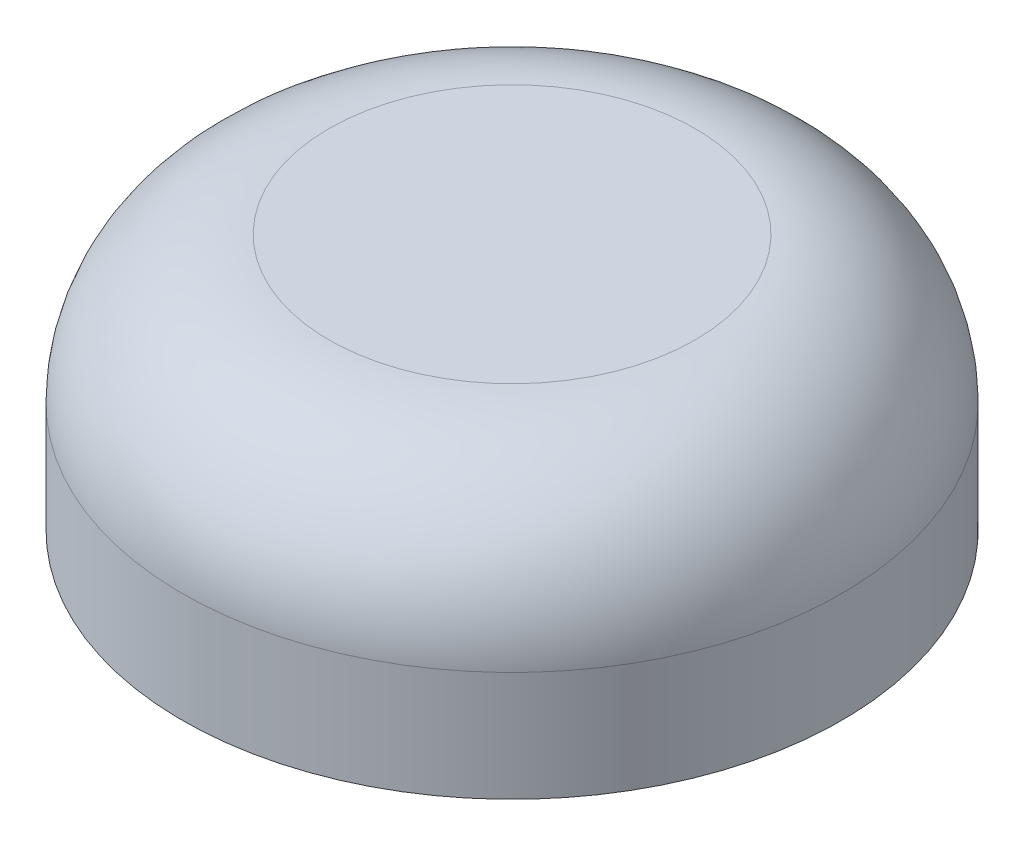
ISO-10303-21;
HEADER;
FILE_DESCRIPTION(('STEP AP214'),'2;1');
FILE_NAME('part.step','',(''),(''),'','','');
FILE_SCHEMA(('AUTOMOTIVE_DESIGN { 1 0 10303 214 1 1 1 1 }'));
ENDSEC;
DATA;
#1=APPLICATION_CONTEXT('core data for automotive mechanical design processes');
#2=APPLICATION_PROTOCOL_DEFINITION('international standard','automotive_design',2000,#1);
#3=PRODUCT_CONTEXT('',#1,'mechanical');
#4=PRODUCT('Part','Part','',(#3));
#5=PRODUCT_RELATED_PRODUCT_CATEGORY('part','',(#4));
#6=PRODUCT_DEFINITION_FORMATION('','',#4);
#7=PRODUCT_DEFINITION_CONTEXT('part definition',#1,'design');
#8=PRODUCT_DEFINITION('design','',#6,#7);
#9=PRODUCT_DEFINITION_SHAPE('','',#8);
#10=(LENGTH_UNIT() NAMED_UNIT(*) SI_UNIT(.MILLI.,.METRE.));
#11=(NAMED_UNIT(*) PLANE_ANGLE_UNIT() SI_UNIT($,.RADIAN.));
#12=(NAMED_UNIT(*) SI_UNIT($,.STERADIAN.) SOLID_ANGLE_UNIT());
#13=UNCERTAINTY_MEASURE_WITH_UNIT(LENGTH_MEASURE(1.E-05),#10,'distance_accuracy_value','');
#14=(GEOMETRIC_REPRESENTATION_CONTEXT(3) GLOBAL_UNCERTAINTY_ASSIGNED_CONTEXT((#13)) GLOBAL_UNIT_ASSIGNED_CONTEXT((#10,
#11,#12)) REPRESENTATION_CONTEXT('',''));
#15=CARTESIAN_POINT('',(0.,0.,0.));
#16=DIRECTION('',(0.,0.,1.));
#17=DIRECTION('',(1.,0.,0.));
#18=AXIS2_PLACEMENT_3D('',#15,#16,#17);
#19=CARTESIAN_POINT('',(0.,0.,0.));
#20=DIRECTION('',(0.,1.,0.));
#21=DIRECTION('',(-1.,0.,0.));
#22=AXIS2_PLACEMENT_3D('',#19,#20,#21);
#23=PLANE('',#22);
#24=CARTESIAN_POINT('',(0.,0.,0.));
#25=DIRECTION('',(0.,1.,0.));
#26=DIRECTION('',(-1.,0.,0.));
#27=AXIS2_PLACEMENT_3D('',#24,#25,#26);
#28=CIRCLE('',#27,1.5);
#29=CARTESIAN_POINT('',(-1.5,0.,0.));
#30=VERTEX_POINT('',#29);
#31=EDGE_CURVE('E10',#30,#30,#28,.T.);
#32=ORIENTED_EDGE('',*,*,#31,.F.);
#33=EDGE_LOOP('',(#32));
#34=FACE_BOUND('',#33,.T.);
#35=ADVANCED_FACE('F33',(#34),#23,.F.);
#36=CARTESIAN_POINT('',(0.,2.,0.));
#37=DIRECTION('',(0.,1.,0.));
#38=DIRECTION('',(-1.,0.,0.));
#39=AXIS2_PLACEMENT_3D('',#36,#37,#38);
#40=CYLINDRICAL_SURFACE('',#39,1.5);
#41=CARTESIAN_POINT('',(0.,-1.5,0.));
#42=DIRECTION('',(0.,1.,0.));
#43=DIRECTION('',(-1.,0.,0.));
#44=AXIS2_PLACEMENT_3D('',#41,#42,#43);
#45=CIRCLE('',#44,1.5);
#46=CARTESIAN_POINT('',(-1.5,-1.5,0.));
#47=VERTEX_POINT('',#46);
#48=EDGE_CURVE('E39',#47,#47,#45,.T.);
#49=ORIENTED_EDGE('',*,*,#48,.F.);
#50=EDGE_LOOP('',(#49));
#51=FACE_BOUND('',#50,.T.);
#52=ORIENTED_EDGE('',*,*,#31,.T.);
#53=EDGE_LOOP('',(#52));
#54=FACE_BOUND('',#53,.T.);
#55=ADVANCED_FACE('F72',(#51,#54),#40,.F.);
#56=CARTESIAN_POINT('',(1.5,-1.5,0.));
#57=DIRECTION('',(0.,1.,0.));
#58=DIRECTION('',(-1.,0.,0.));
#59=AXIS2_PLACEMENT_3D('',#56,#57,#58);
#60=PLANE('',#59);
#61=CARTESIAN_POINT('',(0.,-1.5,0.));
#62=DIRECTION('',(0.,1.,0.));
#63=DIRECTION('',(-1.,0.,0.));
#64=AXIS2_PLACEMENT_3D('',#61,#62,#63);
#65=CIRCLE('',#64,4.5);
#66=CARTESIAN_POINT('',(-4.5,-1.5,0.));
#67=VERTEX_POINT('',#66);
#68=EDGE_CURVE('E43',#67,#67,#65,.T.);
#69=ORIENTED_EDGE('',*,*,#68,.F.);
#70=EDGE_LOOP('',(#69));
#71=FACE_BOUND('',#70,.T.);
#72=ORIENTED_EDGE('',*,*,#48,.T.);
#73=EDGE_LOOP('',(#72));
#74=FACE_BOUND('',#73,.T.);
#75=ADVANCED_FACE('F67',(#71,#74),#60,.F.);
#76=CARTESIAN_POINT('',(0.,2.,0.));
#77=DIRECTION('',(0.,1.,0.));
#78=DIRECTION('',(-1.,0.,0.));
#79=AXIS2_PLACEMENT_3D('',#76,#77,#78);
#80=CYLINDRICAL_SURFACE('',#79,4.5);
#81=CARTESIAN_POINT('',(0.,0.,0.));
#82=DIRECTION('',(0.,1.,0.));
#83=DIRECTION('',(-1.,0.,0.));
#84=AXIS2_PLACEMENT_3D('',#81,#82,#83);
#85=CIRCLE('',#84,4.5);
#86=CARTESIAN_POINT('',(-4.5,0.,0.));
#87=VERTEX_POINT('',#86);
#88=EDGE_CURVE('E47',#87,#87,#85,.T.);
#89=ORIENTED_EDGE('',*,*,#88,.F.);
#90=EDGE_LOOP('',(#89));
#91=FACE_BOUND('',#90,.T.);
#92=ORIENTED_EDGE('',*,*,#68,.T.);
#93=EDGE_LOOP('',(#92));
#94=FACE_BOUND('',#93,.T.);
#95=ADVANCED_FACE('F61',(#91,#94),#80,.T.);
#96=CARTESIAN_POINT('',(0.,0.,0.));
#97=DIRECTION('',(0.,1.,0.));
#98=DIRECTION('',(-1.,0.,0.));
#99=AXIS2_PLACEMENT_3D('',#96,#97,#98);
#100=TOROIDAL_SURFACE('',#99,2.5,2.);
#101=CARTESIAN_POINT('',(0.,2.,0.));
#102=DIRECTION('',(0.,1.,0.));
#103=DIRECTION('',(-1.,0.,0.));
#104=AXIS2_PLACEMENT_3D('',#101,#102,#103);
#105=CIRCLE('',#104,2.5);
#106=CARTESIAN_POINT('',(-2.5,2.,0.));
#107=VERTEX_POINT('',#106);
#108=EDGE_CURVE('E52',#107,#107,#105,.T.);
#109=ORIENTED_EDGE('',*,*,#108,.F.);
#110=EDGE_LOOP('',(#109));
#111=FACE_BOUND('',#110,.T.);
#112=ORIENTED_EDGE('',*,*,#88,.T.);
#113=EDGE_LOOP('',(#112));
#114=FACE_BOUND('',#113,.T.);
#115=ADVANCED_FACE('F58',(#111,#114),#100,.T.);
#116=CARTESIAN_POINT('',(2.5,2.,0.));
#117=DIRECTION('',(0.,-1.,0.));
#118=DIRECTION('',(1.,0.,0.));
#119=AXIS2_PLACEMENT_3D('',#116,#117,#118);
#120=PLANE('',#119);
#121=ORIENTED_EDGE('',*,*,#108,.T.);
#122=EDGE_LOOP('',(#121));
#123=FACE_BOUND('',#122,.T.);
#124=ADVANCED_FACE('F56',(#123),#120,.F.);
#125=CLOSED_SHELL('',(#35,#55,#75,#95,#115,#124));
#126=MANIFOLD_SOLID_BREP('B2',#125);
#127=ADVANCED_BREP_SHAPE_REPRESENTATION('',(#18,#126),#14);
#128=SHAPE_DEFINITION_REPRESENTATION(#9,#127);
ENDSEC;
END-ISO-10303-21;
